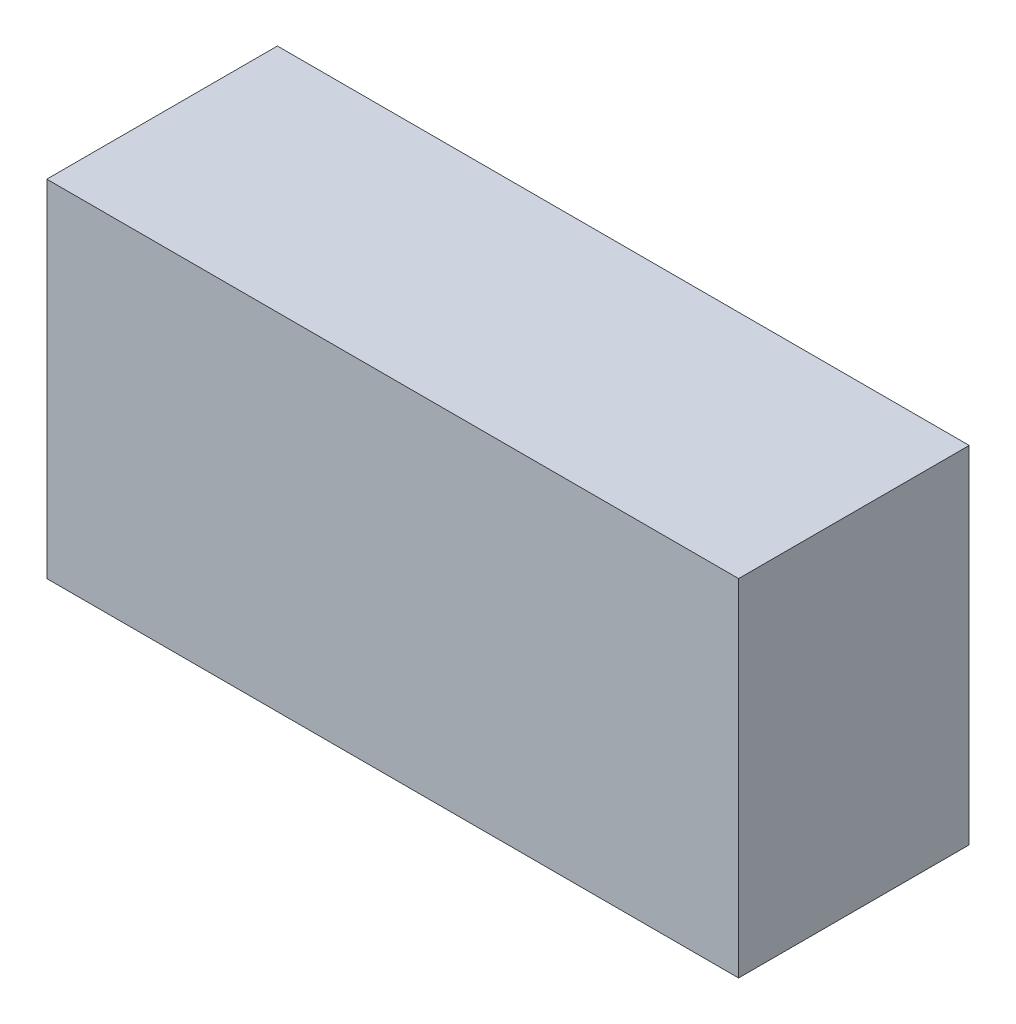
ISO-10303-21;
HEADER;
FILE_DESCRIPTION(('STEP AP214'),'2;1');
FILE_NAME('part.step','',(''),(''),'','','');
FILE_SCHEMA(('AUTOMOTIVE_DESIGN { 1 0 10303 214 1 1 1 1 }'));
ENDSEC;
DATA;
#1=APPLICATION_CONTEXT('core data for automotive mechanical design processes');
#2=APPLICATION_PROTOCOL_DEFINITION('international standard','automotive_design',2000,#1);
#3=PRODUCT_CONTEXT('',#1,'mechanical');
#4=PRODUCT('Part','Part','',(#3));
#5=PRODUCT_RELATED_PRODUCT_CATEGORY('part','',(#4));
#6=PRODUCT_DEFINITION_FORMATION('','',#4);
#7=PRODUCT_DEFINITION_CONTEXT('part definition',#1,'design');
#8=PRODUCT_DEFINITION('design','',#6,#7);
#9=PRODUCT_DEFINITION_SHAPE('','',#8);
#10=(LENGTH_UNIT() NAMED_UNIT(*) SI_UNIT(.MILLI.,.METRE.));
#11=(NAMED_UNIT(*) PLANE_ANGLE_UNIT() SI_UNIT($,.RADIAN.));
#12=(NAMED_UNIT(*) SI_UNIT($,.STERADIAN.) SOLID_ANGLE_UNIT());
#13=UNCERTAINTY_MEASURE_WITH_UNIT(LENGTH_MEASURE(1.E-05),#10,'distance_accuracy_value','');
#14=(GEOMETRIC_REPRESENTATION_CONTEXT(3) GLOBAL_UNCERTAINTY_ASSIGNED_CONTEXT((#13)) GLOBAL_UNIT_ASSIGNED_CONTEXT((#10,
#11,#12)) REPRESENTATION_CONTEXT('',''));
#15=CARTESIAN_POINT('',(0.,0.,0.));
#16=DIRECTION('',(0.,0.,1.));
#17=DIRECTION('',(1.,0.,0.));
#18=AXIS2_PLACEMENT_3D('',#15,#16,#17);
#19=CARTESIAN_POINT('',(-30.,30.,20.));
#20=DIRECTION('',(1.,0.,0.));
#21=DIRECTION('',(0.,0.,-1.));
#22=AXIS2_PLACEMENT_3D('',#19,#20,#21);
#23=PLANE('',#22);
#24=DIRECTION('',(0.,-1.,0.));
#25=VECTOR('',#24,1.);
#26=CARTESIAN_POINT('',(-30.,30.,0.));
#27=LINE('',#26,#25);
#28=CARTESIAN_POINT('',(-30.,30.,0.));
#29=VERTEX_POINT('',#28);
#30=CARTESIAN_POINT('',(-30.,0.,0.));
#31=VERTEX_POINT('',#30);
#32=EDGE_CURVE('E96',#29,#31,#27,.T.);
#33=ORIENTED_EDGE('',*,*,#32,.T.);
#34=DIRECTION('',(0.,0.,-1.));
#35=VECTOR('',#34,1.);
#36=CARTESIAN_POINT('',(-30.,0.,20.));
#37=LINE('',#36,#35);
#38=CARTESIAN_POINT('',(-30.,0.,20.));
#39=VERTEX_POINT('',#38);
#40=EDGE_CURVE('E11',#39,#31,#37,.T.);
#41=ORIENTED_EDGE('',*,*,#40,.F.);
#42=DIRECTION('',(0.,-1.,0.));
#43=VECTOR('',#42,1.);
#44=CARTESIAN_POINT('',(-30.,30.,20.));
#45=LINE('',#44,#43);
#46=CARTESIAN_POINT('',(-30.,30.,20.));
#47=VERTEX_POINT('',#46);
#48=EDGE_CURVE('E84',#47,#39,#45,.T.);
#49=ORIENTED_EDGE('',*,*,#48,.F.);
#50=DIRECTION('',(0.,0.,-1.));
#51=VECTOR('',#50,1.);
#52=CARTESIAN_POINT('',(-30.,30.,20.));
#53=LINE('',#52,#51);
#54=EDGE_CURVE('E92',#47,#29,#53,.T.);
#55=ORIENTED_EDGE('',*,*,#54,.T.);
#56=EDGE_LOOP('',(#33,#41,#49,#55));
#57=FACE_BOUND('',#56,.T.);
#58=ADVANCED_FACE('F33',(#57),#23,.F.);
#59=CARTESIAN_POINT('',(-30.,0.,20.));
#60=DIRECTION('',(0.,1.,0.));
#61=DIRECTION('',(0.,0.,1.));
#62=AXIS2_PLACEMENT_3D('',#59,#60,#61);
#63=PLANE('',#62);
#64=DIRECTION('',(1.,0.,0.));
#65=VECTOR('',#64,1.);
#66=CARTESIAN_POINT('',(-30.,0.,0.));
#67=LINE('',#66,#65);
#68=CARTESIAN_POINT('',(30.,0.,0.));
#69=VERTEX_POINT('',#68);
#70=EDGE_CURVE('E88',#31,#69,#67,.T.);
#71=ORIENTED_EDGE('',*,*,#70,.T.);
#72=DIRECTION('',(0.,0.,-1.));
#73=VECTOR('',#72,1.);
#74=CARTESIAN_POINT('',(30.,0.,20.));
#75=LINE('',#74,#73);
#76=CARTESIAN_POINT('',(30.,0.,20.));
#77=VERTEX_POINT('',#76);
#78=EDGE_CURVE('E41',#77,#69,#75,.T.);
#79=ORIENTED_EDGE('',*,*,#78,.F.);
#80=DIRECTION('',(1.,0.,0.));
#81=VECTOR('',#80,1.);
#82=CARTESIAN_POINT('',(-30.,0.,20.));
#83=LINE('',#82,#81);
#84=EDGE_CURVE('E79',#39,#77,#83,.T.);
#85=ORIENTED_EDGE('',*,*,#84,.F.);
#86=ORIENTED_EDGE('',*,*,#40,.T.);
#87=EDGE_LOOP('',(#71,#79,#85,#86));
#88=FACE_BOUND('',#87,.T.);
#89=ADVANCED_FACE('F87',(#88),#63,.F.);
#90=CARTESIAN_POINT('',(30.,30.,20.));
#91=DIRECTION('',(-1.,0.,0.));
#92=DIRECTION('',(0.,0.,1.));
#93=AXIS2_PLACEMENT_3D('',#90,#91,#92);
#94=PLANE('',#93);
#95=DIRECTION('',(0.,1.,0.));
#96=VECTOR('',#95,1.);
#97=CARTESIAN_POINT('',(30.,30.,0.));
#98=LINE('',#97,#96);
#99=CARTESIAN_POINT('',(30.,30.,0.));
#100=VERTEX_POINT('',#99);
#101=EDGE_CURVE('E66',#69,#100,#98,.T.);
#102=ORIENTED_EDGE('',*,*,#101,.T.);
#103=DIRECTION('',(0.,0.,-1.));
#104=VECTOR('',#103,1.);
#105=CARTESIAN_POINT('',(30.,30.,20.));
#106=LINE('',#105,#104);
#107=CARTESIAN_POINT('',(30.,30.,20.));
#108=VERTEX_POINT('',#107);
#109=EDGE_CURVE('E89',#108,#100,#106,.T.);
#110=ORIENTED_EDGE('',*,*,#109,.F.);
#111=DIRECTION('',(0.,1.,0.));
#112=VECTOR('',#111,1.);
#113=CARTESIAN_POINT('',(30.,30.,20.));
#114=LINE('',#113,#112);
#115=EDGE_CURVE('E82',#77,#108,#114,.T.);
#116=ORIENTED_EDGE('',*,*,#115,.F.);
#117=ORIENTED_EDGE('',*,*,#78,.T.);
#118=EDGE_LOOP('',(#102,#110,#116,#117));
#119=FACE_BOUND('',#118,.T.);
#120=ADVANCED_FACE('F90',(#119),#94,.F.);
#121=CARTESIAN_POINT('',(-30.,30.,20.));
#122=DIRECTION('',(0.,-1.,0.));
#123=DIRECTION('',(0.,0.,-1.));
#124=AXIS2_PLACEMENT_3D('',#121,#122,#123);
#125=PLANE('',#124);
#126=DIRECTION('',(-1.,0.,0.));
#127=VECTOR('',#126,1.);
#128=CARTESIAN_POINT('',(-30.,30.,0.));
#129=LINE('',#128,#127);
#130=EDGE_CURVE('E72',#100,#29,#129,.T.);
#131=ORIENTED_EDGE('',*,*,#130,.T.);
#132=ORIENTED_EDGE('',*,*,#54,.F.);
#133=DIRECTION('',(-1.,0.,0.));
#134=VECTOR('',#133,1.);
#135=CARTESIAN_POINT('',(-30.,30.,20.));
#136=LINE('',#135,#134);
#137=EDGE_CURVE('E49',#108,#47,#136,.T.);
#138=ORIENTED_EDGE('',*,*,#137,.F.);
#139=ORIENTED_EDGE('',*,*,#109,.T.);
#140=EDGE_LOOP('',(#131,#132,#138,#139));
#141=FACE_BOUND('',#140,.T.);
#142=ADVANCED_FACE('F103',(#141),#125,.F.);
#143=CARTESIAN_POINT('',(0.,0.,20.));
#144=DIRECTION('',(0.,0.,1.));
#145=DIRECTION('',(1.,0.,0.));
#146=AXIS2_PLACEMENT_3D('',#143,#144,#145);
#147=PLANE('',#146);
#148=ORIENTED_EDGE('',*,*,#48,.T.);
#149=ORIENTED_EDGE('',*,*,#84,.T.);
#150=ORIENTED_EDGE('',*,*,#115,.T.);
#151=ORIENTED_EDGE('',*,*,#137,.T.);
#152=EDGE_LOOP('',(#148,#149,#150,#151));
#153=FACE_BOUND('',#152,.T.);
#154=ADVANCED_FACE('F80',(#153),#147,.T.);
#155=CARTESIAN_POINT('',(0.,0.,0.));
#156=DIRECTION('',(0.,0.,1.));
#157=DIRECTION('',(1.,0.,0.));
#158=AXIS2_PLACEMENT_3D('',#155,#156,#157);
#159=PLANE('',#158);
#160=ORIENTED_EDGE('',*,*,#32,.F.);
#161=ORIENTED_EDGE('',*,*,#130,.F.);
#162=ORIENTED_EDGE('',*,*,#101,.F.);
#163=ORIENTED_EDGE('',*,*,#70,.F.);
#164=EDGE_LOOP('',(#160,#161,#162,#163));
#165=FACE_BOUND('',#164,.T.);
#166=ADVANCED_FACE('F106',(#165),#159,.F.);
#167=CLOSED_SHELL('',(#58,#89,#120,#142,#154,#166));
#168=MANIFOLD_SOLID_BREP('B2',#167);
#169=ADVANCED_BREP_SHAPE_REPRESENTATION('',(#18,#168),#14);
#170=SHAPE_DEFINITION_REPRESENTATION(#9,#169);
ENDSEC;
END-ISO-10303-21;
